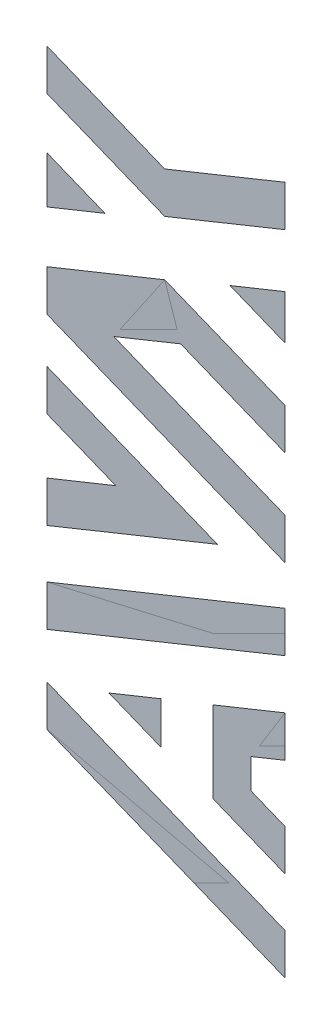
ISO-10303-21;
HEADER;
FILE_DESCRIPTION(('STEP AP214'),'2;1');
FILE_NAME('part.step','',(''),(''),'','','');
FILE_SCHEMA(('AUTOMOTIVE_DESIGN { 1 0 10303 214 1 1 1 1 }'));
ENDSEC;
DATA;
#1=APPLICATION_CONTEXT('core data for automotive mechanical design processes');
#2=APPLICATION_PROTOCOL_DEFINITION('international standard','automotive_design',2000,#1);
#3=PRODUCT_CONTEXT('',#1,'mechanical');
#4=PRODUCT('Part','Part','',(#3));
#5=PRODUCT_RELATED_PRODUCT_CATEGORY('part','',(#4));
#6=PRODUCT_DEFINITION_FORMATION('','',#4);
#7=PRODUCT_DEFINITION_CONTEXT('part definition',#1,'design');
#8=PRODUCT_DEFINITION('design','',#6,#7);
#9=PRODUCT_DEFINITION_SHAPE('','',#8);
#10=(LENGTH_UNIT() NAMED_UNIT(*) SI_UNIT(.MILLI.,.METRE.));
#11=(NAMED_UNIT(*) PLANE_ANGLE_UNIT() SI_UNIT($,.RADIAN.));
#12=(NAMED_UNIT(*) SI_UNIT($,.STERADIAN.) SOLID_ANGLE_UNIT());
#13=UNCERTAINTY_MEASURE_WITH_UNIT(LENGTH_MEASURE(1.E-05),#10,'distance_accuracy_value','');
#14=(GEOMETRIC_REPRESENTATION_CONTEXT(3) GLOBAL_UNCERTAINTY_ASSIGNED_CONTEXT((#13)) GLOBAL_UNIT_ASSIGNED_CONTEXT((#10,
#11,#12)) REPRESENTATION_CONTEXT('',''));
#15=CARTESIAN_POINT('',(0.,0.,0.));
#16=DIRECTION('',(0.,0.,1.));
#17=DIRECTION('',(1.,0.,0.));
#18=AXIS2_PLACEMENT_3D('',#15,#16,#17);
#19=CARTESIAN_POINT('',(75.868976597191,24.125371355467,4.301));
#20=DIRECTION('',(0.,0.,-1.));
#21=DIRECTION('',(-1.,0.,0.));
#22=AXIS2_PLACEMENT_3D('',#19,#20,#21);
#23=PLANE('',#22);
#24=CARTESIAN_POINT('',(75.868976594845,24.32211742582,4.3004));
#25=DIRECTION('',(0.,-1.,0.));
#26=VECTOR('',#25,1.);
#27=LINE('',#24,#26);
#28=CARTESIAN_POINT('',(75.868976594845,24.32211742582,4.3007));
#29=VERTEX_POINT('',#28);
#30=CARTESIAN_POINT('',(75.868976594845,24.2043974252527,4.3007));
#31=VERTEX_POINT('',#30);
#32=EDGE_CURVE('P0_E41',#29,#31,#27,.T.);
#33=ORIENTED_EDGE('',*,*,#32,.F.);
#34=CARTESIAN_POINT('',(75.186416599538,24.0463452775423,4.3004));
#35=DIRECTION('',(0.927183850099792,0.374606604472114,0.));
#36=VECTOR('',#35,1.);
#37=LINE('',#34,#36);
#38=CARTESIAN_POINT('',(75.186416599538,24.0463452775423,4.3007));
#39=VERTEX_POINT('',#38);
#40=EDGE_CURVE('P0_E44',#39,#29,#37,.T.);
#41=ORIENTED_EDGE('',*,*,#40,.F.);
#42=CARTESIAN_POINT('',(75.186416599538,23.928625276975,4.3004));
#43=DIRECTION('',(0.,1.,0.));
#44=VECTOR('',#43,1.);
#45=LINE('',#42,#44);
#46=CARTESIAN_POINT('',(75.186416599538,23.928625276975,4.3007));
#47=VERTEX_POINT('',#46);
#48=EDGE_CURVE('P0_E11',#47,#39,#45,.T.);
#49=ORIENTED_EDGE('',*,*,#48,.F.);
#50=CARTESIAN_POINT('',(75.868976594845,24.2043974252527,4.3004));
#51=DIRECTION('',(-0.927183850099792,-0.374606604472114,0.));
#52=VECTOR('',#51,1.);
#53=LINE('',#50,#52);
#54=EDGE_CURVE('P0_E28',#31,#47,#53,.T.);
#55=ORIENTED_EDGE('',*,*,#54,.F.);
#56=EDGE_LOOP('',(#33,#41,#49,#55));
#57=FACE_BOUND('',#56,.T.);
#58=ADVANCED_FACE('P0_F17',(#57),#23,.F.);
#59=CARTESIAN_POINT('',(75.868976597191,24.125371355467,4.3004));
#60=DIRECTION('',(0.,0.,-1.));
#61=DIRECTION('',(-1.,0.,0.));
#62=AXIS2_PLACEMENT_3D('',#59,#60,#61);
#63=PLANE('',#62);
#64=ORIENTED_EDGE('',*,*,#54,.T.);
#65=ORIENTED_EDGE('',*,*,#48,.T.);
#66=ORIENTED_EDGE('',*,*,#40,.T.);
#67=ORIENTED_EDGE('',*,*,#32,.T.);
#68=EDGE_LOOP('',(#64,#65,#66,#67));
#69=FACE_BOUND('',#68,.T.);
#70=ADVANCED_FACE('P0_F49',(#69),#63,.T.);
#71=CLOSED_SHELL('',(#58,#70));
#72=MANIFOLD_SOLID_BREP('P0_B1',#71);
#73=CARTESIAN_POINT('',(75.513205518144,23.859529123119,4.301));
#74=DIRECTION('',(0.,0.,-1.));
#75=DIRECTION('',(-1.,0.,0.));
#76=AXIS2_PLACEMENT_3D('',#73,#74,#75);
#77=PLANE('',#76);
#78=CARTESIAN_POINT('',(75.513205517427,23.7993489391688,4.3004));
#79=DIRECTION('',(-0.927183859032534,0.3746065823628,0.));
#80=VECTOR('',#79,1.);
#81=LINE('',#78,#80);
#82=CARTESIAN_POINT('',(75.513205517427,23.7993489391688,4.3007));
#83=VERTEX_POINT('',#82);
#84=CARTESIAN_POINT('',(75.364254334579,23.859529121343,4.3007));
#85=VERTEX_POINT('',#84);
#86=EDGE_CURVE('P1_E28',#83,#85,#81,.T.);
#87=ORIENTED_EDGE('',*,*,#86,.F.);
#88=CARTESIAN_POINT('',(75.513205517427,23.919709307649,4.3004));
#89=DIRECTION('',(0.,-1.,0.));
#90=VECTOR('',#89,1.);
#91=LINE('',#88,#90);
#92=CARTESIAN_POINT('',(75.513205517427,23.919709307649,4.3007));
#93=VERTEX_POINT('',#92);
#94=EDGE_CURVE('P1_E39',#93,#83,#91,.T.);
#95=ORIENTED_EDGE('',*,*,#94,.F.);
#96=CARTESIAN_POINT('',(75.364254334579,23.859529121343,4.3004));
#97=DIRECTION('',(0.927183850099498,0.374606604472841,0.));
#98=VECTOR('',#97,1.);
#99=LINE('',#96,#98);
#100=EDGE_CURVE('P1_E11',#85,#93,#99,.T.);
#101=ORIENTED_EDGE('',*,*,#100,.F.);
#102=EDGE_LOOP('',(#87,#95,#101));
#103=FACE_BOUND('',#102,.T.);
#104=ADVANCED_FACE('P1_F17',(#103),#77,.F.);
#105=CARTESIAN_POINT('',(75.513205518144,23.859529123119,4.3004));
#106=DIRECTION('',(0.,0.,-1.));
#107=DIRECTION('',(-1.,0.,0.));
#108=AXIS2_PLACEMENT_3D('',#105,#106,#107);
#109=PLANE('',#108);
#110=ORIENTED_EDGE('',*,*,#86,.T.);
#111=ORIENTED_EDGE('',*,*,#100,.T.);
#112=ORIENTED_EDGE('',*,*,#94,.T.);
#113=EDGE_LOOP('',(#110,#111,#112));
#114=FACE_BOUND('',#113,.T.);
#115=ADVANCED_FACE('P1_F44',(#114),#109,.T.);
#116=CLOSED_SHELL('',(#104,#115));
#117=MANIFOLD_SOLID_BREP('P1_B1',#116);
#118=CARTESIAN_POINT('',(75.352797607575,25.044205477646,4.301));
#119=DIRECTION('',(0.,0.,-1.));
#120=DIRECTION('',(-1.,0.,0.));
#121=AXIS2_PLACEMENT_3D('',#118,#119,#120);
#122=PLANE('',#121);
#123=CARTESIAN_POINT('',(75.352797607575,25.044205477646,4.3004));
#124=DIRECTION('',(-0.927183850099497,-0.374606604472844,0.));
#125=VECTOR('',#124,1.);
#126=LINE('',#123,#125);
#127=CARTESIAN_POINT('',(75.352797607575,25.044205477646,4.3007));
#128=VERTEX_POINT('',#127);
#129=CARTESIAN_POINT('',(75.186416587036,24.976983179559,4.3007));
#130=VERTEX_POINT('',#129);
#131=EDGE_CURVE('P2_E28',#128,#130,#126,.T.);
#132=ORIENTED_EDGE('',*,*,#131,.F.);
#133=CARTESIAN_POINT('',(75.186416587036,25.1114277711163,4.3004));
#134=DIRECTION('',(0.927183859035248,-0.374606582356085,0.));
#135=VECTOR('',#134,1.);
#136=LINE('',#133,#135);
#137=CARTESIAN_POINT('',(75.186416587036,25.1114277711163,4.3007));
#138=VERTEX_POINT('',#137);
#139=EDGE_CURVE('P2_E39',#138,#128,#136,.T.);
#140=ORIENTED_EDGE('',*,*,#139,.F.);
#141=CARTESIAN_POINT('',(75.186416587036,24.976983179559,4.3004));
#142=DIRECTION('',(0.,1.,0.));
#143=VECTOR('',#142,1.);
#144=LINE('',#141,#143);
#145=EDGE_CURVE('P2_E11',#130,#138,#144,.T.);
#146=ORIENTED_EDGE('',*,*,#145,.F.);
#147=EDGE_LOOP('',(#132,#140,#146));
#148=FACE_BOUND('',#147,.T.);
#149=ADVANCED_FACE('P2_F17',(#148),#122,.F.);
#150=CARTESIAN_POINT('',(75.352797607575,25.044205477646,4.3004));
#151=DIRECTION('',(0.,0.,-1.));
#152=DIRECTION('',(-1.,0.,0.));
#153=AXIS2_PLACEMENT_3D('',#150,#151,#152);
#154=PLANE('',#153);
#155=ORIENTED_EDGE('',*,*,#131,.T.);
#156=ORIENTED_EDGE('',*,*,#145,.T.);
#157=ORIENTED_EDGE('',*,*,#139,.T.);
#158=EDGE_LOOP('',(#155,#156,#157));
#159=FACE_BOUND('',#158,.T.);
#160=ADVANCED_FACE('P2_F44',(#159),#154,.T.);
#161=CLOSED_SHELL('',(#149,#160));
#162=MANIFOLD_SOLID_BREP('P2_B1',#161);
#163=CARTESIAN_POINT('',(75.868976586234,25.044205483801,4.301));
#164=DIRECTION('',(0.,0.,-1.));
#165=DIRECTION('',(-1.,0.,0.));
#166=AXIS2_PLACEMENT_3D('',#163,#164,#165);
#167=PLANE('',#166);
#168=CARTESIAN_POINT('',(75.868976585474,24.9804115210155,4.3004));
#169=DIRECTION('',(-0.927183859035471,0.374606582355531,0.));
#170=VECTOR('',#169,1.);
#171=LINE('',#168,#170);
#172=CARTESIAN_POINT('',(75.868976585474,24.9804115210155,4.3007));
#173=VERTEX_POINT('',#172);
#174=CARTESIAN_POINT('',(75.711080986094,25.044205481918,4.3007));
#175=VERTEX_POINT('',#174);
#176=EDGE_CURVE('P3_E28',#173,#175,#171,.T.);
#177=ORIENTED_EDGE('',*,*,#176,.F.);
#178=CARTESIAN_POINT('',(75.868976585474,25.107999447202,4.3004));
#179=DIRECTION('',(0.,-1.,0.));
#180=VECTOR('',#179,1.);
#181=LINE('',#178,#180);
#182=CARTESIAN_POINT('',(75.868976585474,25.107999447202,4.3007));
#183=VERTEX_POINT('',#182);
#184=EDGE_CURVE('P3_E39',#183,#173,#181,.T.);
#185=ORIENTED_EDGE('',*,*,#184,.F.);
#186=CARTESIAN_POINT('',(75.711080986094,25.044205481918,4.3004));
#187=DIRECTION('',(0.92718385009908,0.374606604473877,0.));
#188=VECTOR('',#187,1.);
#189=LINE('',#186,#188);
#190=EDGE_CURVE('P3_E11',#175,#183,#189,.T.);
#191=ORIENTED_EDGE('',*,*,#190,.F.);
#192=EDGE_LOOP('',(#177,#185,#191));
#193=FACE_BOUND('',#192,.T.);
#194=ADVANCED_FACE('P3_F17',(#193),#167,.F.);
#195=CARTESIAN_POINT('',(75.868976586234,25.044205483801,4.3004));
#196=DIRECTION('',(0.,0.,-1.));
#197=DIRECTION('',(-1.,0.,0.));
#198=AXIS2_PLACEMENT_3D('',#195,#196,#197);
#199=PLANE('',#198);
#200=ORIENTED_EDGE('',*,*,#176,.T.);
#201=ORIENTED_EDGE('',*,*,#190,.T.);
#202=ORIENTED_EDGE('',*,*,#184,.T.);
#203=EDGE_LOOP('',(#200,#201,#202));
#204=FACE_BOUND('',#203,.T.);
#205=ADVANCED_FACE('P3_F44',(#204),#199,.T.);
#206=CLOSED_SHELL('',(#194,#205));
#207=MANIFOLD_SOLID_BREP('P3_B1',#206);
#208=CARTESIAN_POINT('',(75.868976600324,23.862701784914,4.301));
#209=DIRECTION('',(0.,0.,-1.));
#210=DIRECTION('',(-1.,0.,0.));
#211=AXIS2_PLACEMENT_3D('',#208,#209,#210);
#212=PLANE('',#211);
#213=CARTESIAN_POINT('',(75.868976601303,23.6628306041842,4.3004));
#214=DIRECTION('',(-0.92718385903424,0.374606582358578,0.));
#215=VECTOR('',#214,1.);
#216=LINE('',#213,#215);
#217=CARTESIAN_POINT('',(75.868976601303,23.6628306041842,4.3007));
#218=VERTEX_POINT('',#217);
#219=CARTESIAN_POINT('',(75.662844844994,23.746113236851,4.3007));
#220=VERTEX_POINT('',#219);
#221=EDGE_CURVE('P4_E53',#218,#220,#216,.T.);
#222=ORIENTED_EDGE('',*,*,#221,.F.);
#223=CARTESIAN_POINT('',(75.868976601303,23.780550603617,4.3004));
#224=DIRECTION('',(0.,-1.,0.));
#225=VECTOR('',#224,1.);
#226=LINE('',#223,#225);
#227=CARTESIAN_POINT('',(75.868976601303,23.780550603617,4.3007));
#228=VERTEX_POINT('',#227);
#229=EDGE_CURVE('P4_E56',#228,#218,#226,.T.);
#230=ORIENTED_EDGE('',*,*,#229,.F.);
#231=CARTESIAN_POINT('',(75.771837741849,23.8197972490363,4.3004));
#232=DIRECTION('',(0.927183859035127,-0.374606582356384,0.));
#233=VECTOR('',#232,1.);
#234=LINE('',#231,#233);
#235=CARTESIAN_POINT('',(75.771837741849,23.8197972490363,4.3007));
#236=VERTEX_POINT('',#235);
#237=EDGE_CURVE('P4_E11',#236,#228,#234,.T.);
#238=ORIENTED_EDGE('',*,*,#237,.F.);
#239=CARTESIAN_POINT('',(75.771837741849,23.905606318888,4.3004));
#240=DIRECTION('',(0.,-1.,0.));
#241=VECTOR('',#240,1.);
#242=LINE('',#239,#241);
#243=CARTESIAN_POINT('',(75.771837741849,23.905606318888,4.3007));
#244=VERTEX_POINT('',#243);
#245=EDGE_CURVE('P4_E28',#244,#236,#242,.T.);
#246=ORIENTED_EDGE('',*,*,#245,.F.);
#247=CARTESIAN_POINT('',(75.86897659794,23.9448529656438,4.3004));
#248=DIRECTION('',(-0.927183850099999,-0.374606604471601,0.));
#249=VECTOR('',#248,1.);
#250=LINE('',#247,#249);
#251=CARTESIAN_POINT('',(75.86897659794,23.9448529656438,4.3007));
#252=VERTEX_POINT('',#251);
#253=EDGE_CURVE('P4_E144',#252,#244,#250,.T.);
#254=ORIENTED_EDGE('',*,*,#253,.F.);
#255=CARTESIAN_POINT('',(75.86897659794,24.062572966211,4.3004));
#256=DIRECTION('',(0.,-1.,0.));
#257=VECTOR('',#256,1.);
#258=LINE('',#255,#257);
#259=CARTESIAN_POINT('',(75.86897659794,24.062572966211,4.3007));
#260=VERTEX_POINT('',#259);
#261=EDGE_CURVE('P4_E142',#260,#252,#258,.T.);
#262=ORIENTED_EDGE('',*,*,#261,.F.);
#263=CARTESIAN_POINT('',(75.662844844994,23.9792903291836,4.3004));
#264=DIRECTION('',(0.927183850098878,0.374606604474375,0.));
#265=VECTOR('',#264,1.);
#266=LINE('',#263,#265);
#267=CARTESIAN_POINT('',(75.662844844994,23.9792903291836,4.3007));
#268=VERTEX_POINT('',#267);
#269=EDGE_CURVE('P4_E141',#268,#260,#266,.T.);
#270=ORIENTED_EDGE('',*,*,#269,.F.);
#271=CARTESIAN_POINT('',(75.662844844994,23.746113236851,4.3004));
#272=DIRECTION('',(0.,1.,0.));
#273=VECTOR('',#272,1.);
#274=LINE('',#271,#273);
#275=EDGE_CURVE('P4_E139',#220,#268,#274,.T.);
#276=ORIENTED_EDGE('',*,*,#275,.F.);
#277=EDGE_LOOP('',(#222,#230,#238,#246,#254,#262,#270,#276));
#278=FACE_BOUND('',#277,.T.);
#279=ADVANCED_FACE('P4_F17',(#278),#212,.F.);
#280=CARTESIAN_POINT('',(75.868976600324,23.862701784914,4.3004));
#281=DIRECTION('',(0.,0.,-1.));
#282=DIRECTION('',(-1.,0.,0.));
#283=AXIS2_PLACEMENT_3D('',#280,#281,#282);
#284=PLANE('',#283);
#285=ORIENTED_EDGE('',*,*,#245,.T.);
#286=ORIENTED_EDGE('',*,*,#237,.T.);
#287=ORIENTED_EDGE('',*,*,#229,.T.);
#288=ORIENTED_EDGE('',*,*,#221,.T.);
#289=ORIENTED_EDGE('',*,*,#275,.T.);
#290=ORIENTED_EDGE('',*,*,#269,.T.);
#291=ORIENTED_EDGE('',*,*,#261,.T.);
#292=ORIENTED_EDGE('',*,*,#253,.T.);
#293=EDGE_LOOP('',(#285,#286,#287,#288,#289,#290,#291,#292));
#294=FACE_BOUND('',#293,.T.);
#295=ADVANCED_FACE('P4_F61',(#294),#284,.T.);
#296=CLOSED_SHELL('',(#279,#295));
#297=MANIFOLD_SOLID_BREP('P4_B1',#296);
#298=CARTESIAN_POINT('',(75.675050030493,24.383865157749,4.3004));
#299=DIRECTION('',(0.,0.,-1.));
#300=DIRECTION('',(-1.,0.,0.));
#301=AXIS2_PLACEMENT_3D('',#298,#299,#300);
#302=PLANE('',#301);
#303=CARTESIAN_POINT('',(75.383682806109,24.383865154275,4.3004));
#304=DIRECTION('',(-0.927183859035583,0.374606582355255,0.));
#305=VECTOR('',#304,1.);
#306=LINE('',#303,#305);
#307=CARTESIAN_POINT('',(75.383682806109,24.383865154275,4.3007));
#308=VERTEX_POINT('',#307);
#309=CARTESIAN_POINT('',(75.186416593158,24.463565875041,4.3007));
#310=VERTEX_POINT('',#309);
#311=EDGE_CURVE('P5_E47',#308,#310,#306,.T.);
#312=ORIENTED_EDGE('',*,*,#311,.T.);
#313=CARTESIAN_POINT('',(75.186416593158,24.463565875041,4.3004));
#314=DIRECTION('',(0.,1.,0.));
#315=VECTOR('',#314,1.);
#316=LINE('',#313,#315);
#317=CARTESIAN_POINT('',(75.186416593158,24.5812858744752,4.3007));
#318=VERTEX_POINT('',#317);
#319=EDGE_CURVE('P5_E115',#310,#318,#316,.T.);
#320=ORIENTED_EDGE('',*,*,#319,.T.);
#321=CARTESIAN_POINT('',(75.186416593158,24.5812858744752,4.3004));
#322=DIRECTION('',(0.927183859033337,-0.374606582360815,0.));
#323=VECTOR('',#322,1.);
#324=LINE('',#321,#323);
#325=CARTESIAN_POINT('',(75.675050030493,24.383865157749,4.3007));
#326=VERTEX_POINT('',#325);
#327=EDGE_CURVE('P5_E116',#318,#326,#324,.T.);
#328=ORIENTED_EDGE('',*,*,#327,.T.);
#329=CARTESIAN_POINT('',(75.675050030493,24.383865157749,4.3004));
#330=DIRECTION('',(-0.927183850099698,-0.374606604472347,0.));
#331=VECTOR('',#330,1.);
#332=LINE('',#329,#331);
#333=CARTESIAN_POINT('',(75.186416596463,24.186444428803,4.3007));
#334=VERTEX_POINT('',#333);
#335=EDGE_CURVE('P5_E28',#326,#334,#332,.T.);
#336=ORIENTED_EDGE('',*,*,#335,.T.);
#337=CARTESIAN_POINT('',(75.186416596463,24.186444428803,4.3004));
#338=DIRECTION('',(0.,1.,0.));
#339=VECTOR('',#338,1.);
#340=LINE('',#337,#339);
#341=CARTESIAN_POINT('',(75.186416596463,24.3041644293703,4.3007));
#342=VERTEX_POINT('',#341);
#343=EDGE_CURVE('P5_E11',#334,#342,#340,.T.);
#344=ORIENTED_EDGE('',*,*,#343,.T.);
#345=CARTESIAN_POINT('',(75.186416596463,24.3041644293703,4.3004));
#346=DIRECTION('',(0.927183850099156,0.374606604473687,0.));
#347=VECTOR('',#346,1.);
#348=LINE('',#345,#347);
#349=EDGE_CURVE('P5_E50',#342,#308,#348,.T.);
#350=ORIENTED_EDGE('',*,*,#349,.T.);
#351=EDGE_LOOP('',(#312,#320,#328,#336,#344,#350));
#352=FACE_BOUND('',#351,.T.);
#353=ADVANCED_FACE('P5_F17',(#352),#302,.T.);
#354=CARTESIAN_POINT('',(75.675050030493,24.383865157749,4.301));
#355=DIRECTION('',(0.,0.,-1.));
#356=DIRECTION('',(-1.,0.,0.));
#357=AXIS2_PLACEMENT_3D('',#354,#355,#356);
#358=PLANE('',#357);
#359=ORIENTED_EDGE('',*,*,#335,.F.);
#360=ORIENTED_EDGE('',*,*,#327,.F.);
#361=ORIENTED_EDGE('',*,*,#319,.F.);
#362=ORIENTED_EDGE('',*,*,#311,.F.);
#363=ORIENTED_EDGE('',*,*,#349,.F.);
#364=ORIENTED_EDGE('',*,*,#343,.F.);
#365=EDGE_LOOP('',(#359,#360,#361,#362,#363,#364));
#366=FACE_BOUND('',#365,.T.);
#367=ADVANCED_FACE('P5_F52',(#366),#358,.F.);
#368=CLOSED_SHELL('',(#353,#367));
#369=MANIFOLD_SOLID_BREP('P5_B1',#368);
#370=CARTESIAN_POINT('',(75.868976583771,25.250824150151,4.301));
#371=DIRECTION('',(0.,0.,-1.));
#372=DIRECTION('',(-1.,0.,0.));
#373=AXIS2_PLACEMENT_3D('',#370,#371,#372);
#374=PLANE('',#373);
#375=CARTESIAN_POINT('',(75.523916585304,25.122257501293,4.3004));
#376=DIRECTION('',(-0.92718385903363,0.374606582360088,0.));
#377=VECTOR('',#376,1.);
#378=LINE('',#375,#377);
#379=CARTESIAN_POINT('',(75.523916585304,25.122257501293,4.3007));
#380=VERTEX_POINT('',#379);
#381=CARTESIAN_POINT('',(75.186416583678,25.258616348488,4.3007));
#382=VERTEX_POINT('',#381);
#383=EDGE_CURVE('P6_E47',#380,#382,#378,.T.);
#384=ORIENTED_EDGE('',*,*,#383,.F.);
#385=CARTESIAN_POINT('',(75.868976582237,25.2616707943277,4.3004));
#386=DIRECTION('',(-0.927183850098969,-0.374606604474149,0.));
#387=VECTOR('',#386,1.);
#388=LINE('',#385,#387);
#389=CARTESIAN_POINT('',(75.868976582237,25.2616707943277,4.3007));
#390=VERTEX_POINT('',#389);
#391=EDGE_CURVE('P6_E50',#390,#380,#388,.T.);
#392=ORIENTED_EDGE('',*,*,#391,.F.);
#393=CARTESIAN_POINT('',(75.868976582237,25.379390794895,4.3004));
#394=DIRECTION('',(0.,-1.,0.));
#395=VECTOR('',#394,1.);
#396=LINE('',#393,#395);
#397=CARTESIAN_POINT('',(75.868976582237,25.379390794895,4.3007));
#398=VERTEX_POINT('',#397);
#399=EDGE_CURVE('P6_E11',#398,#390,#396,.T.);
#400=ORIENTED_EDGE('',*,*,#399,.F.);
#401=CARTESIAN_POINT('',(75.5239165839,25.239977501293,4.3004));
#402=DIRECTION('',(0.927183850098967,0.374606604474157,0.));
#403=VECTOR('',#402,1.);
#404=LINE('',#401,#403);
#405=CARTESIAN_POINT('',(75.5239165839,25.239977501293,4.3007));
#406=VERTEX_POINT('',#405);
#407=EDGE_CURVE('P6_E28',#406,#398,#404,.T.);
#408=ORIENTED_EDGE('',*,*,#407,.F.);
#409=CARTESIAN_POINT('',(75.186416583678,25.3763363479208,4.3004));
#410=DIRECTION('',(0.92718385903363,-0.374606582360089,0.));
#411=VECTOR('',#410,1.);
#412=LINE('',#409,#411);
#413=CARTESIAN_POINT('',(75.186416583678,25.3763363479208,4.3007));
#414=VERTEX_POINT('',#413);
#415=EDGE_CURVE('P6_E122',#414,#406,#412,.T.);
#416=ORIENTED_EDGE('',*,*,#415,.F.);
#417=CARTESIAN_POINT('',(75.186416583678,25.258616348488,4.3004));
#418=DIRECTION('',(0.,1.,0.));
#419=VECTOR('',#418,1.);
#420=LINE('',#417,#419);
#421=EDGE_CURVE('P6_E121',#382,#414,#420,.T.);
#422=ORIENTED_EDGE('',*,*,#421,.F.);
#423=EDGE_LOOP('',(#384,#392,#400,#408,#416,#422));
#424=FACE_BOUND('',#423,.T.);
#425=ADVANCED_FACE('P6_F17',(#424),#374,.F.);
#426=CARTESIAN_POINT('',(75.868976583771,25.250824150151,4.3004));
#427=DIRECTION('',(0.,0.,-1.));
#428=DIRECTION('',(-1.,0.,0.));
#429=AXIS2_PLACEMENT_3D('',#426,#427,#428);
#430=PLANE('',#429);
#431=ORIENTED_EDGE('',*,*,#407,.T.);
#432=ORIENTED_EDGE('',*,*,#399,.T.);
#433=ORIENTED_EDGE('',*,*,#391,.T.);
#434=ORIENTED_EDGE('',*,*,#383,.T.);
#435=ORIENTED_EDGE('',*,*,#421,.T.);
#436=ORIENTED_EDGE('',*,*,#415,.T.);
#437=EDGE_LOOP('',(#431,#432,#433,#434,#435,#436));
#438=FACE_BOUND('',#437,.T.);
#439=ADVANCED_FACE('P6_F55',(#438),#430,.T.);
#440=CLOSED_SHELL('',(#425,#439));
#441=MANIFOLD_SOLID_BREP('P6_B1',#440);
#442=CARTESIAN_POINT('',(75.868976590339,24.700020272099,4.3004));
#443=DIRECTION('',(0.,0.,-1.));
#444=DIRECTION('',(-1.,0.,0.));
#445=AXIS2_PLACEMENT_3D('',#442,#443,#444);
#446=PLANE('',#445);
#447=CARTESIAN_POINT('',(75.569797037546,24.828688859949,4.3004));
#448=DIRECTION('',(-0.927183850100398,-0.374606604470614,0.));
#449=VECTOR('',#448,1.);
#450=LINE('',#447,#449);
#451=CARTESIAN_POINT('',(75.569797037546,24.828688859949,4.3007));
#452=VERTEX_POINT('',#451);
#453=CARTESIAN_POINT('',(75.377980650663,24.751190006443,4.3007));
#454=VERTEX_POINT('',#453);
#455=EDGE_CURVE('P7_E146',#452,#454,#450,.T.);
#456=ORIENTED_EDGE('',*,*,#455,.T.);
#457=CARTESIAN_POINT('',(75.377980650663,24.751190006443,4.3004));
#458=DIRECTION('',(0.927183859033869,-0.374606582359498,0.));
#459=VECTOR('',#458,1.);
#460=LINE('',#457,#459);
#461=CARTESIAN_POINT('',(75.868976592094,24.552814776137,4.3007));
#462=VERTEX_POINT('',#461);
#463=EDGE_CURVE('P7_E147',#454,#462,#460,.T.);
#464=ORIENTED_EDGE('',*,*,#463,.T.);
#465=CARTESIAN_POINT('',(75.868976592094,24.552814776137,4.3004));
#466=DIRECTION('',(0.,-1.,0.));
#467=VECTOR('',#466,1.);
#468=LINE('',#465,#467);
#469=CARTESIAN_POINT('',(75.868976592094,24.4350947767033,4.3007));
#470=VERTEX_POINT('',#469);
#471=EDGE_CURVE('P7_E149',#462,#470,#468,.T.);
#472=ORIENTED_EDGE('',*,*,#471,.T.);
#473=CARTESIAN_POINT('',(75.868976592094,24.4350947767033,4.3004));
#474=DIRECTION('',(-0.927183859033822,0.374606582359614,0.));
#475=VECTOR('',#474,1.);
#476=LINE('',#473,#475);
#477=CARTESIAN_POINT('',(75.186416590209,24.710866908703,4.3007));
#478=VERTEX_POINT('',#477);
#479=EDGE_CURVE('P7_E28',#470,#478,#476,.T.);
#480=ORIENTED_EDGE('',*,*,#479,.T.);
#481=CARTESIAN_POINT('',(75.186416590209,24.710866908703,4.3004));
#482=DIRECTION('',(0.,1.,0.));
#483=VECTOR('',#482,1.);
#484=LINE('',#481,#483);
#485=CARTESIAN_POINT('',(75.186416590209,24.8285869092699,4.3007));
#486=VERTEX_POINT('',#485);
#487=EDGE_CURVE('P7_E11',#478,#486,#484,.T.);
#488=ORIENTED_EDGE('',*,*,#487,.T.);
#489=CARTESIAN_POINT('',(75.186416590209,24.8285869092699,4.3004));
#490=DIRECTION('',(0.927183850099681,0.374606604472388,0.));
#491=VECTOR('',#490,1.);
#492=LINE('',#489,#491);
#493=CARTESIAN_POINT('',(75.52391658718,24.964945763947,4.3007));
#494=VERTEX_POINT('',#493);
#495=EDGE_CURVE('P7_E59',#486,#494,#492,.T.);
#496=ORIENTED_EDGE('',*,*,#495,.T.);
#497=CARTESIAN_POINT('',(75.52391658718,24.964945763947,4.3004));
#498=DIRECTION('',(0.927183859033634,-0.37460658236008,0.));
#499=VECTOR('',#498,1.);
#500=LINE('',#497,#499);
#501=CARTESIAN_POINT('',(75.868976588842,24.825532478575,4.3007));
#502=VERTEX_POINT('',#501);
#503=EDGE_CURVE('P7_E56',#494,#502,#500,.T.);
#504=ORIENTED_EDGE('',*,*,#503,.T.);
#505=CARTESIAN_POINT('',(75.868976588842,24.825532478575,4.3004));
#506=DIRECTION('',(0.,-1.,0.));
#507=VECTOR('',#506,1.);
#508=LINE('',#505,#507);
#509=CARTESIAN_POINT('',(75.868976588842,24.7078124791423,4.3007));
#510=VERTEX_POINT('',#509);
#511=EDGE_CURVE('P7_E144',#502,#510,#508,.T.);
#512=ORIENTED_EDGE('',*,*,#511,.T.);
#513=CARTESIAN_POINT('',(75.868976588842,24.7078124791423,4.3004));
#514=DIRECTION('',(-0.927183859034331,0.374606582358353,0.));
#515=VECTOR('',#514,1.);
#516=LINE('',#513,#515);
#517=EDGE_CURVE('P7_E145',#510,#452,#516,.T.);
#518=ORIENTED_EDGE('',*,*,#517,.T.);
#519=EDGE_LOOP('',(#456,#464,#472,#480,#488,#496,#504,#512,#518));
#520=FACE_BOUND('',#519,.T.);
#521=ADVANCED_FACE('P7_F17',(#520),#446,.T.);
#522=CARTESIAN_POINT('',(75.868976590339,24.700020272099,4.301));
#523=DIRECTION('',(0.,0.,-1.));
#524=DIRECTION('',(-1.,0.,0.));
#525=AXIS2_PLACEMENT_3D('',#522,#523,#524);
#526=PLANE('',#525);
#527=ORIENTED_EDGE('',*,*,#479,.F.);
#528=ORIENTED_EDGE('',*,*,#471,.F.);
#529=ORIENTED_EDGE('',*,*,#463,.F.);
#530=ORIENTED_EDGE('',*,*,#455,.F.);
#531=ORIENTED_EDGE('',*,*,#517,.F.);
#532=ORIENTED_EDGE('',*,*,#511,.F.);
#533=ORIENTED_EDGE('',*,*,#503,.F.);
#534=ORIENTED_EDGE('',*,*,#495,.F.);
#535=ORIENTED_EDGE('',*,*,#487,.F.);
#536=EDGE_LOOP('',(#527,#528,#529,#530,#531,#532,#533,#534,#535));
#537=FACE_BOUND('',#536,.T.);
#538=ADVANCED_FACE('P7_F61',(#537),#526,.F.);
#539=CLOSED_SHELL('',(#521,#538));
#540=MANIFOLD_SOLID_BREP('P7_B1',#539);
#541=CARTESIAN_POINT('',(75.868976603441,23.601314588415,4.3004));
#542=DIRECTION('',(0.,0.,-1.));
#543=DIRECTION('',(-1.,0.,0.));
#544=AXIS2_PLACEMENT_3D('',#541,#542,#543);
#545=PLANE('',#544);
#546=CARTESIAN_POINT('',(75.186416602498,23.680340650628,4.3004));
#547=DIRECTION('',(0.,1.,0.));
#548=VECTOR('',#547,1.);
#549=LINE('',#546,#548);
#550=CARTESIAN_POINT('',(75.186416602498,23.680340650628,4.3007));
#551=VERTEX_POINT('',#550);
#552=CARTESIAN_POINT('',(75.186416602498,23.7980606500611,4.3007));
#553=VERTEX_POINT('',#552);
#554=EDGE_CURVE('P8_E11',#551,#553,#549,.T.);
#555=ORIENTED_EDGE('',*,*,#554,.T.);
#556=CARTESIAN_POINT('',(75.186416602498,23.7980606500611,4.3004));
#557=DIRECTION('',(0.927183859034102,-0.374606582358921,0.));
#558=VECTOR('',#557,1.);
#559=LINE('',#556,#558);
#560=CARTESIAN_POINT('',(75.868976604383,23.522288518062,4.3007));
#561=VERTEX_POINT('',#560);
#562=EDGE_CURVE('P8_E44',#553,#561,#559,.T.);
#563=ORIENTED_EDGE('',*,*,#562,.T.);
#564=CARTESIAN_POINT('',(75.868976604383,23.522288518062,4.3004));
#565=DIRECTION('',(0.,-1.,0.));
#566=VECTOR('',#565,1.);
#567=LINE('',#564,#566);
#568=CARTESIAN_POINT('',(75.868976604383,23.4045685186293,4.3007));
#569=VERTEX_POINT('',#568);
#570=EDGE_CURVE('P8_E41',#561,#569,#567,.T.);
#571=ORIENTED_EDGE('',*,*,#570,.T.);
#572=CARTESIAN_POINT('',(75.868976604383,23.4045685186293,4.3004));
#573=DIRECTION('',(-0.927183859034293,0.374606582358447,0.));
#574=VECTOR('',#573,1.);
#575=LINE('',#572,#574);
#576=EDGE_CURVE('P8_E28',#569,#551,#575,.T.);
#577=ORIENTED_EDGE('',*,*,#576,.T.);
#578=EDGE_LOOP('',(#555,#563,#571,#577));
#579=FACE_BOUND('',#578,.T.);
#580=ADVANCED_FACE('P8_F17',(#579),#545,.T.);
#581=CARTESIAN_POINT('',(75.868976603441,23.601314588415,4.301));
#582=DIRECTION('',(0.,0.,-1.));
#583=DIRECTION('',(-1.,0.,0.));
#584=AXIS2_PLACEMENT_3D('',#581,#582,#583);
#585=PLANE('',#584);
#586=ORIENTED_EDGE('',*,*,#576,.F.);
#587=ORIENTED_EDGE('',*,*,#570,.F.);
#588=ORIENTED_EDGE('',*,*,#562,.F.);
#589=ORIENTED_EDGE('',*,*,#554,.F.);
#590=EDGE_LOOP('',(#586,#587,#588,#589));
#591=FACE_BOUND('',#590,.T.);
#592=ADVANCED_FACE('P8_F46',(#591),#585,.F.);
#593=CLOSED_SHELL('',(#580,#592));
#594=MANIFOLD_SOLID_BREP('P8_B1',#593);
#595=ADVANCED_BREP_SHAPE_REPRESENTATION('',(#18,#72,#117,#162,#207,#297,#369,#441,#540,#594),#14);
#596=SHAPE_DEFINITION_REPRESENTATION(#9,#595);
ENDSEC;
END-ISO-10303-21;
